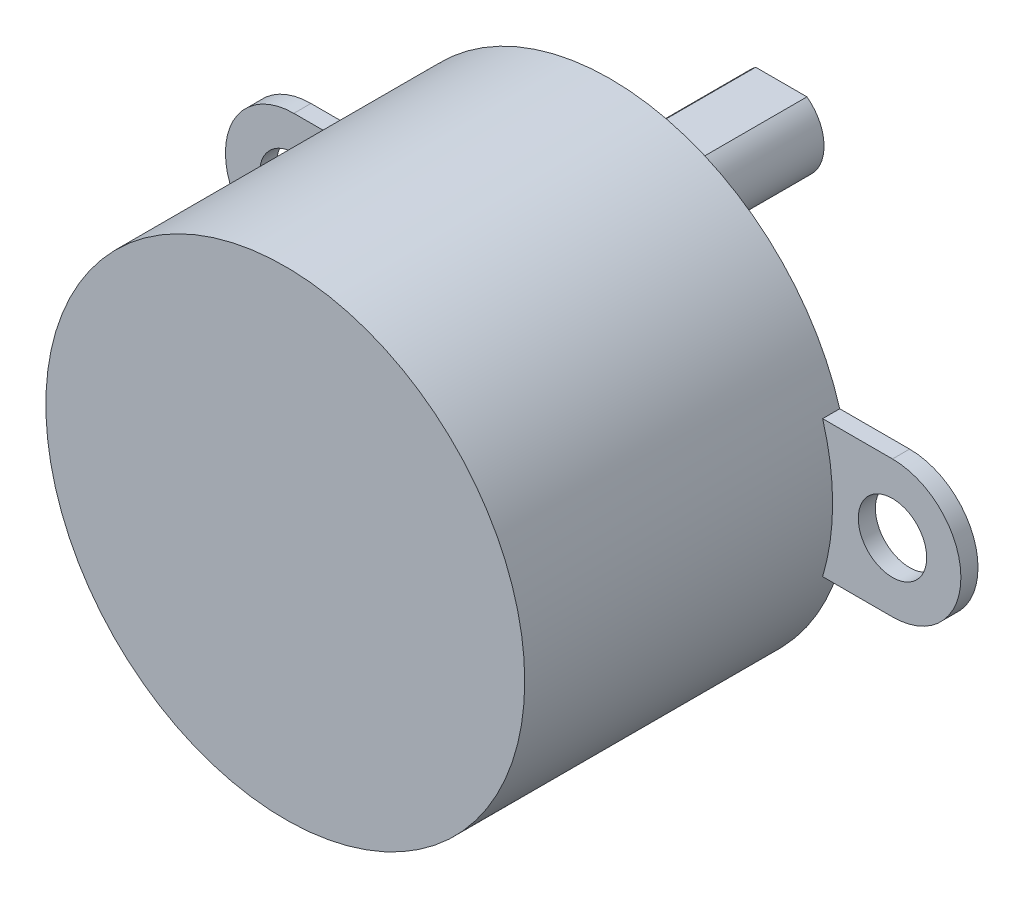
ISO-10303-21;
HEADER;
FILE_DESCRIPTION(('STEP AP214'),'2;1');
FILE_NAME('part.step','',(''),(''),'','','');
FILE_SCHEMA(('AUTOMOTIVE_DESIGN { 1 0 10303 214 1 1 1 1 }'));
ENDSEC;
DATA;
#1=APPLICATION_CONTEXT('core data for automotive mechanical design processes');
#2=APPLICATION_PROTOCOL_DEFINITION('international standard','automotive_design',2000,#1);
#3=PRODUCT_CONTEXT('',#1,'mechanical');
#4=PRODUCT('Part','Part','',(#3));
#5=PRODUCT_RELATED_PRODUCT_CATEGORY('part','',(#4));
#6=PRODUCT_DEFINITION_FORMATION('','',#4);
#7=PRODUCT_DEFINITION_CONTEXT('part definition',#1,'design');
#8=PRODUCT_DEFINITION('design','',#6,#7);
#9=PRODUCT_DEFINITION_SHAPE('','',#8);
#10=(LENGTH_UNIT() NAMED_UNIT(*) SI_UNIT(.MILLI.,.METRE.));
#11=(NAMED_UNIT(*) PLANE_ANGLE_UNIT() SI_UNIT($,.RADIAN.));
#12=(NAMED_UNIT(*) SI_UNIT($,.STERADIAN.) SOLID_ANGLE_UNIT());
#13=UNCERTAINTY_MEASURE_WITH_UNIT(LENGTH_MEASURE(1.E-05),#10,'distance_accuracy_value','');
#14=(GEOMETRIC_REPRESENTATION_CONTEXT(3) GLOBAL_UNCERTAINTY_ASSIGNED_CONTEXT((#13)) GLOBAL_UNIT_ASSIGNED_CONTEXT((#10,
#11,#12)) REPRESENTATION_CONTEXT('',''));
#15=CARTESIAN_POINT('',(0.,0.,0.));
#16=DIRECTION('',(0.,0.,1.));
#17=DIRECTION('',(1.,0.,0.));
#18=AXIS2_PLACEMENT_3D('',#15,#16,#17);
#19=CARTESIAN_POINT('',(0.,6.83524579595485,-10.));
#20=DIRECTION('',(0.,0.,1.));
#21=DIRECTION('',(1.,0.,0.));
#22=AXIS2_PLACEMENT_3D('',#19,#20,#21);
#23=CYLINDRICAL_SURFACE('',#22,2.5);
#24=CARTESIAN_POINT('',(0.,6.83524579595485,-10.));
#25=DIRECTION('',(0.,0.,-1.));
#26=DIRECTION('',(-1.,0.,0.));
#27=AXIS2_PLACEMENT_3D('',#24,#25,#26);
#28=CIRCLE('',#27,2.5);
#29=CARTESIAN_POINT('',(-1.5,4.83524579595485,-10.));
#30=VERTEX_POINT('',#29);
#31=CARTESIAN_POINT('',(-1.5,8.83524579595485,-10.));
#32=VERTEX_POINT('',#31);
#33=EDGE_CURVE('E158',#30,#32,#28,.T.);
#34=ORIENTED_EDGE('',*,*,#33,.F.);
#35=DIRECTION('',(0.,0.,-1.));
#36=VECTOR('',#35,1.);
#37=CARTESIAN_POINT('',(-1.5,4.83524579595485,1.24138126514911));
#38=LINE('',#37,#36);
#39=CARTESIAN_POINT('',(-1.5,4.83524579595485,-1.8));
#40=VERTEX_POINT('',#39);
#41=EDGE_CURVE('E55',#40,#30,#38,.T.);
#42=ORIENTED_EDGE('',*,*,#41,.F.);
#43=CARTESIAN_POINT('',(0.,6.83524579595485,-1.8));
#44=DIRECTION('',(0.,0.,-1.));
#45=DIRECTION('',(-1.,0.,0.));
#46=AXIS2_PLACEMENT_3D('',#43,#44,#45);
#47=CIRCLE('',#46,2.5);
#48=CARTESIAN_POINT('',(-1.5,8.83524579595485,-1.8));
#49=VERTEX_POINT('',#48);
#50=EDGE_CURVE('E146',#40,#49,#47,.T.);
#51=ORIENTED_EDGE('',*,*,#50,.T.);
#52=DIRECTION('',(0.,0.,-1.));
#53=VECTOR('',#52,1.);
#54=CARTESIAN_POINT('',(-1.5,8.83524579595485,1.24138126514911));
#55=LINE('',#54,#53);
#56=EDGE_CURVE('E253',#49,#32,#55,.T.);
#57=ORIENTED_EDGE('',*,*,#56,.T.);
#58=EDGE_LOOP('',(#34,#42,#51,#57));
#59=FACE_BOUND('',#58,.T.);
#60=ADVANCED_FACE('F39',(#59),#23,.T.);
#61=CARTESIAN_POINT('',(0.,0.,19.));
#62=DIRECTION('',(0.,0.,-1.));
#63=DIRECTION('',(-1.,0.,0.));
#64=AXIS2_PLACEMENT_3D('',#61,#62,#63);
#65=CYLINDRICAL_SURFACE('',#64,14.);
#66=CARTESIAN_POINT('',(0.,0.,1.));
#67=DIRECTION('',(0.,0.,-1.));
#68=DIRECTION('',(-1.,0.,0.));
#69=AXIS2_PLACEMENT_3D('',#66,#67,#68);
#70=CIRCLE('',#69,14.);
#71=CARTESIAN_POINT('',(13.4164078649987,4.00000000000001,1.));
#72=VERTEX_POINT('',#71);
#73=CARTESIAN_POINT('',(13.4164078649987,-4.00000000000001,1.));
#74=VERTEX_POINT('',#73);
#75=EDGE_CURVE('E11',#72,#74,#70,.T.);
#76=ORIENTED_EDGE('',*,*,#75,.F.);
#77=DIRECTION('',(0.,0.,-1.));
#78=VECTOR('',#77,1.);
#79=CARTESIAN_POINT('',(13.4164078649987,4.00000000000001,19.));
#80=LINE('',#79,#78);
#81=CARTESIAN_POINT('',(13.4164078649987,4.00000000000001,0.));
#82=VERTEX_POINT('',#81);
#83=EDGE_CURVE('E237',#72,#82,#80,.T.);
#84=ORIENTED_EDGE('',*,*,#83,.T.);
#85=CARTESIAN_POINT('',(0.,0.,0.));
#86=DIRECTION('',(0.,0.,1.));
#87=DIRECTION('',(1.,0.,0.));
#88=AXIS2_PLACEMENT_3D('',#85,#86,#87);
#89=CIRCLE('',#88,14.);
#90=CARTESIAN_POINT('',(-13.4164078649987,4.00000000000001,0.));
#91=VERTEX_POINT('',#90);
#92=EDGE_CURVE('E172',#82,#91,#89,.T.);
#93=ORIENTED_EDGE('',*,*,#92,.T.);
#94=DIRECTION('',(0.,0.,-1.));
#95=VECTOR('',#94,1.);
#96=CARTESIAN_POINT('',(-13.4164078649987,4.00000000000001,19.));
#97=LINE('',#96,#95);
#98=CARTESIAN_POINT('',(-13.4164078649987,4.00000000000001,1.));
#99=VERTEX_POINT('',#98);
#100=EDGE_CURVE('E235',#91,#99,#97,.F.);
#101=ORIENTED_EDGE('',*,*,#100,.T.);
#102=CARTESIAN_POINT('',(-13.4164078649987,-4.,1.));
#103=VERTEX_POINT('',#102);
#104=EDGE_CURVE('E43',#103,#99,#70,.T.);
#105=ORIENTED_EDGE('',*,*,#104,.F.);
#106=DIRECTION('',(0.,0.,-1.));
#107=VECTOR('',#106,1.);
#108=CARTESIAN_POINT('',(-13.4164078649987,-4.,19.));
#109=LINE('',#108,#107);
#110=CARTESIAN_POINT('',(-13.4164078649987,-4.,0.));
#111=VERTEX_POINT('',#110);
#112=EDGE_CURVE('E183',#103,#111,#109,.T.);
#113=ORIENTED_EDGE('',*,*,#112,.T.);
#114=CARTESIAN_POINT('',(13.4164078649987,-4.00000000000001,0.));
#115=VERTEX_POINT('',#114);
#116=EDGE_CURVE('E164',#111,#115,#89,.T.);
#117=ORIENTED_EDGE('',*,*,#116,.T.);
#118=DIRECTION('',(0.,0.,-1.));
#119=VECTOR('',#118,1.);
#120=CARTESIAN_POINT('',(13.4164078649987,-4.00000000000001,19.));
#121=LINE('',#120,#119);
#122=EDGE_CURVE('E181',#115,#74,#121,.F.);
#123=ORIENTED_EDGE('',*,*,#122,.T.);
#124=EDGE_LOOP('',(#76,#84,#93,#101,#105,#113,#117,#123));
#125=FACE_BOUND('',#124,.T.);
#126=CARTESIAN_POINT('',(0.,0.,19.));
#127=DIRECTION('',(0.,0.,1.));
#128=DIRECTION('',(1.,0.,0.));
#129=AXIS2_PLACEMENT_3D('',#126,#127,#128);
#130=CIRCLE('',#129,14.);
#131=CARTESIAN_POINT('',(14.,0.,19.));
#132=VERTEX_POINT('',#131);
#133=EDGE_CURVE('E155',#132,#132,#130,.T.);
#134=ORIENTED_EDGE('',*,*,#133,.F.);
#135=EDGE_LOOP('',(#134));
#136=FACE_BOUND('',#135,.T.);
#137=ADVANCED_FACE('F41',(#125,#136),#65,.T.);
#138=CARTESIAN_POINT('',(0.,0.,19.));
#139=DIRECTION('',(0.,0.,1.));
#140=DIRECTION('',(1.,0.,0.));
#141=AXIS2_PLACEMENT_3D('',#138,#139,#140);
#142=PLANE('',#141);
#143=ORIENTED_EDGE('',*,*,#133,.T.);
#144=EDGE_LOOP('',(#143));
#145=FACE_BOUND('',#144,.T.);
#146=ADVANCED_FACE('F322',(#145),#142,.T.);
#147=CARTESIAN_POINT('',(0.,0.,0.));
#148=DIRECTION('',(0.,0.,1.));
#149=DIRECTION('',(1.,0.,0.));
#150=AXIS2_PLACEMENT_3D('',#147,#148,#149);
#151=PLANE('',#150);
#152=CARTESIAN_POINT('',(0.,6.83524579595485,0.));
#153=DIRECTION('',(0.,0.,1.));
#154=DIRECTION('',(1.,0.,0.));
#155=AXIS2_PLACEMENT_3D('',#152,#153,#154);
#156=CIRCLE('',#155,4.);
#157=CARTESIAN_POINT('',(4.,6.83524579595485,0.));
#158=VERTEX_POINT('',#157);
#159=EDGE_CURVE('E165',#158,#158,#156,.T.);
#160=ORIENTED_EDGE('',*,*,#159,.T.);
#161=EDGE_LOOP('',(#160));
#162=FACE_BOUND('',#161,.T.);
#163=ORIENTED_EDGE('',*,*,#116,.F.);
#164=DIRECTION('',(-1.,0.,0.));
#165=VECTOR('',#164,1.);
#166=CARTESIAN_POINT('',(17.5,-4.00000000000001,0.));
#167=LINE('',#166,#165);
#168=CARTESIAN_POINT('',(-17.5,-4.,0.));
#169=VERTEX_POINT('',#168);
#170=EDGE_CURVE('E204',#111,#169,#167,.T.);
#171=ORIENTED_EDGE('',*,*,#170,.T.);
#172=CARTESIAN_POINT('',(-17.5,0.,0.));
#173=DIRECTION('',(0.,0.,-1.));
#174=DIRECTION('',(-1.,0.,0.));
#175=AXIS2_PLACEMENT_3D('',#172,#173,#174);
#176=CIRCLE('',#175,4.00000000000001);
#177=CARTESIAN_POINT('',(-17.5,4.00000000000001,0.));
#178=VERTEX_POINT('',#177);
#179=EDGE_CURVE('E203',#169,#178,#176,.T.);
#180=ORIENTED_EDGE('',*,*,#179,.T.);
#181=DIRECTION('',(1.,0.,0.));
#182=VECTOR('',#181,1.);
#183=CARTESIAN_POINT('',(17.5,4.00000000000001,0.));
#184=LINE('',#183,#182);
#185=EDGE_CURVE('E214',#178,#91,#184,.T.);
#186=ORIENTED_EDGE('',*,*,#185,.T.);
#187=ORIENTED_EDGE('',*,*,#92,.F.);
#188=CARTESIAN_POINT('',(17.5,4.00000000000001,0.));
#189=VERTEX_POINT('',#188);
#190=EDGE_CURVE('E209',#82,#189,#184,.T.);
#191=ORIENTED_EDGE('',*,*,#190,.T.);
#192=CARTESIAN_POINT('',(17.5,0.,0.));
#193=DIRECTION('',(0.,0.,-1.));
#194=DIRECTION('',(-1.,0.,0.));
#195=AXIS2_PLACEMENT_3D('',#192,#193,#194);
#196=CIRCLE('',#195,4.00000000000001);
#197=CARTESIAN_POINT('',(17.5,-4.00000000000001,0.));
#198=VERTEX_POINT('',#197);
#199=EDGE_CURVE('E201',#189,#198,#196,.T.);
#200=ORIENTED_EDGE('',*,*,#199,.T.);
#201=EDGE_CURVE('E191',#198,#115,#167,.T.);
#202=ORIENTED_EDGE('',*,*,#201,.T.);
#203=EDGE_LOOP('',(#163,#171,#180,#186,#187,#191,#200,#202));
#204=FACE_BOUND('',#203,.T.);
#205=CARTESIAN_POINT('',(-17.5,0.,0.));
#206=DIRECTION('',(0.,0.,-1.));
#207=DIRECTION('',(-1.,0.,0.));
#208=AXIS2_PLACEMENT_3D('',#205,#206,#207);
#209=CIRCLE('',#208,2.);
#210=CARTESIAN_POINT('',(-19.5,0.,0.));
#211=VERTEX_POINT('',#210);
#212=EDGE_CURVE('E265',#211,#211,#209,.T.);
#213=ORIENTED_EDGE('',*,*,#212,.F.);
#214=EDGE_LOOP('',(#213));
#215=FACE_BOUND('',#214,.T.);
#216=CARTESIAN_POINT('',(17.5,0.,0.));
#217=DIRECTION('',(0.,0.,-1.));
#218=DIRECTION('',(-1.,0.,0.));
#219=AXIS2_PLACEMENT_3D('',#216,#217,#218);
#220=CIRCLE('',#219,2.);
#221=CARTESIAN_POINT('',(15.5,0.,0.));
#222=VERTEX_POINT('',#221);
#223=EDGE_CURVE('E266',#222,#222,#220,.T.);
#224=ORIENTED_EDGE('',*,*,#223,.F.);
#225=EDGE_LOOP('',(#224));
#226=FACE_BOUND('',#225,.T.);
#227=ADVANCED_FACE('F198',(#162,#204,#215,#226),#151,.F.);
#228=CARTESIAN_POINT('',(0.,6.83524579595485,-1.8));
#229=DIRECTION('',(0.,0.,1.));
#230=DIRECTION('',(1.,0.,0.));
#231=AXIS2_PLACEMENT_3D('',#228,#229,#230);
#232=CYLINDRICAL_SURFACE('',#231,4.);
#233=CARTESIAN_POINT('',(0.,6.83524579595485,-1.8));
#234=DIRECTION('',(0.,0.,1.));
#235=DIRECTION('',(1.,0.,0.));
#236=AXIS2_PLACEMENT_3D('',#233,#234,#235);
#237=CIRCLE('',#236,4.);
#238=CARTESIAN_POINT('',(4.,6.83524579595485,-1.8));
#239=VERTEX_POINT('',#238);
#240=EDGE_CURVE('E160',#239,#239,#237,.T.);
#241=ORIENTED_EDGE('',*,*,#240,.T.);
#242=EDGE_LOOP('',(#241));
#243=FACE_BOUND('',#242,.T.);
#244=ORIENTED_EDGE('',*,*,#159,.F.);
#245=EDGE_LOOP('',(#244));
#246=FACE_BOUND('',#245,.T.);
#247=ADVANCED_FACE('F331',(#243,#246),#232,.T.);
#248=CARTESIAN_POINT('',(0.,6.83524579595485,-1.8));
#249=DIRECTION('',(0.,0.,1.));
#250=DIRECTION('',(1.,0.,0.));
#251=AXIS2_PLACEMENT_3D('',#248,#249,#250);
#252=PLANE('',#251);
#253=CARTESIAN_POINT('',(1.5,8.83524579595485,-1.8));
#254=VERTEX_POINT('',#253);
#255=CARTESIAN_POINT('',(1.5,4.83524579595485,-1.8));
#256=VERTEX_POINT('',#255);
#257=EDGE_CURVE('E144',#254,#256,#47,.T.);
#258=ORIENTED_EDGE('',*,*,#257,.F.);
#259=DIRECTION('',(-1.,0.,0.));
#260=VECTOR('',#259,1.);
#261=CARTESIAN_POINT('',(1.5,8.83524579595485,-1.8));
#262=LINE('',#261,#260);
#263=EDGE_CURVE('E250',#254,#49,#262,.T.);
#264=ORIENTED_EDGE('',*,*,#263,.T.);
#265=ORIENTED_EDGE('',*,*,#50,.F.);
#266=DIRECTION('',(1.,0.,0.));
#267=VECTOR('',#266,1.);
#268=CARTESIAN_POINT('',(-1.5,4.83524579595485,-1.8));
#269=LINE('',#268,#267);
#270=EDGE_CURVE('E130',#40,#256,#269,.T.);
#271=ORIENTED_EDGE('',*,*,#270,.T.);
#272=EDGE_LOOP('',(#258,#264,#265,#271));
#273=FACE_BOUND('',#272,.T.);
#274=ORIENTED_EDGE('',*,*,#240,.F.);
#275=EDGE_LOOP('',(#274));
#276=FACE_BOUND('',#275,.T.);
#277=ADVANCED_FACE('F141',(#273,#276),#252,.F.);
#278=ORIENTED_EDGE('',*,*,#257,.T.);
#279=DIRECTION('',(0.,0.,-1.));
#280=VECTOR('',#279,1.);
#281=CARTESIAN_POINT('',(1.5,4.83524579595485,1.24138126514911));
#282=LINE('',#281,#280);
#283=CARTESIAN_POINT('',(1.5,4.83524579595485,-10.));
#284=VERTEX_POINT('',#283);
#285=EDGE_CURVE('E127',#256,#284,#282,.T.);
#286=ORIENTED_EDGE('',*,*,#285,.T.);
#287=CARTESIAN_POINT('',(1.5,8.83524579595485,-10.));
#288=VERTEX_POINT('',#287);
#289=EDGE_CURVE('E169',#288,#284,#28,.T.);
#290=ORIENTED_EDGE('',*,*,#289,.F.);
#291=DIRECTION('',(0.,0.,-1.));
#292=VECTOR('',#291,1.);
#293=CARTESIAN_POINT('',(1.5,8.83524579595485,1.24138126514911));
#294=LINE('',#293,#292);
#295=EDGE_CURVE('E63',#254,#288,#294,.T.);
#296=ORIENTED_EDGE('',*,*,#295,.F.);
#297=EDGE_LOOP('',(#278,#286,#290,#296));
#298=FACE_BOUND('',#297,.T.);
#299=ADVANCED_FACE('F149',(#298),#23,.T.);
#300=CARTESIAN_POINT('',(0.,6.83524579595485,-10.));
#301=DIRECTION('',(0.,0.,-1.));
#302=DIRECTION('',(-1.,0.,0.));
#303=AXIS2_PLACEMENT_3D('',#300,#301,#302);
#304=PLANE('',#303);
#305=DIRECTION('',(1.,0.,0.));
#306=VECTOR('',#305,1.);
#307=CARTESIAN_POINT('',(-1.5,4.83524579595485,-10.));
#308=LINE('',#307,#306);
#309=EDGE_CURVE('E131',#30,#284,#308,.T.);
#310=ORIENTED_EDGE('',*,*,#309,.F.);
#311=ORIENTED_EDGE('',*,*,#33,.T.);
#312=DIRECTION('',(-1.,0.,0.));
#313=VECTOR('',#312,1.);
#314=CARTESIAN_POINT('',(1.5,8.83524579595485,-10.));
#315=LINE('',#314,#313);
#316=EDGE_CURVE('E247',#288,#32,#315,.T.);
#317=ORIENTED_EDGE('',*,*,#316,.F.);
#318=ORIENTED_EDGE('',*,*,#289,.T.);
#319=EDGE_LOOP('',(#310,#311,#317,#318));
#320=FACE_BOUND('',#319,.T.);
#321=ADVANCED_FACE('F246',(#320),#304,.T.);
#322=CARTESIAN_POINT('',(-17.5,0.,1.));
#323=DIRECTION('',(0.,0.,-1.));
#324=DIRECTION('',(-1.,0.,0.));
#325=AXIS2_PLACEMENT_3D('',#322,#323,#324);
#326=CYLINDRICAL_SURFACE('',#325,4.00000000000001);
#327=ORIENTED_EDGE('',*,*,#179,.F.);
#328=DIRECTION('',(0.,0.,-1.));
#329=VECTOR('',#328,1.);
#330=CARTESIAN_POINT('',(-17.5,-4.,1.));
#331=LINE('',#330,#329);
#332=CARTESIAN_POINT('',(-17.5,-4.,1.));
#333=VERTEX_POINT('',#332);
#334=EDGE_CURVE('E225',#333,#169,#331,.T.);
#335=ORIENTED_EDGE('',*,*,#334,.F.);
#336=CARTESIAN_POINT('',(-17.5,0.,1.));
#337=DIRECTION('',(0.,0.,-1.));
#338=DIRECTION('',(-1.,0.,0.));
#339=AXIS2_PLACEMENT_3D('',#336,#337,#338);
#340=CIRCLE('',#339,4.00000000000001);
#341=CARTESIAN_POINT('',(-17.5,4.00000000000001,1.));
#342=VERTEX_POINT('',#341);
#343=EDGE_CURVE('E283',#333,#342,#340,.T.);
#344=ORIENTED_EDGE('',*,*,#343,.T.);
#345=DIRECTION('',(0.,0.,-1.));
#346=VECTOR('',#345,1.);
#347=CARTESIAN_POINT('',(-17.5,4.00000000000001,1.));
#348=LINE('',#347,#346);
#349=EDGE_CURVE('E222',#342,#178,#348,.T.);
#350=ORIENTED_EDGE('',*,*,#349,.T.);
#351=EDGE_LOOP('',(#327,#335,#344,#350));
#352=FACE_BOUND('',#351,.T.);
#353=ADVANCED_FACE('F330',(#352),#326,.T.);
#354=CARTESIAN_POINT('',(-17.5,0.,1.));
#355=DIRECTION('',(0.,0.,-1.));
#356=DIRECTION('',(-1.,0.,0.));
#357=AXIS2_PLACEMENT_3D('',#354,#355,#356);
#358=CYLINDRICAL_SURFACE('',#357,2.);
#359=CARTESIAN_POINT('',(-17.5,0.,1.));
#360=DIRECTION('',(0.,0.,-1.));
#361=DIRECTION('',(-1.,0.,0.));
#362=AXIS2_PLACEMENT_3D('',#359,#360,#361);
#363=CIRCLE('',#362,2.);
#364=CARTESIAN_POINT('',(-19.5,0.,1.));
#365=VERTEX_POINT('',#364);
#366=EDGE_CURVE('E270',#365,#365,#363,.T.);
#367=ORIENTED_EDGE('',*,*,#366,.F.);
#368=EDGE_LOOP('',(#367));
#369=FACE_BOUND('',#368,.T.);
#370=ORIENTED_EDGE('',*,*,#212,.T.);
#371=EDGE_LOOP('',(#370));
#372=FACE_BOUND('',#371,.T.);
#373=ADVANCED_FACE('F314',(#369,#372),#358,.F.);
#374=CARTESIAN_POINT('',(17.5,0.,1.));
#375=DIRECTION('',(0.,0.,-1.));
#376=DIRECTION('',(-1.,0.,0.));
#377=AXIS2_PLACEMENT_3D('',#374,#375,#376);
#378=PLANE('',#377);
#379=ORIENTED_EDGE('',*,*,#366,.T.);
#380=EDGE_LOOP('',(#379));
#381=FACE_BOUND('',#380,.T.);
#382=DIRECTION('',(-1.,0.,0.));
#383=VECTOR('',#382,1.);
#384=CARTESIAN_POINT('',(17.5,-4.00000000000001,1.));
#385=LINE('',#384,#383);
#386=EDGE_CURVE('E280',#103,#333,#385,.T.);
#387=ORIENTED_EDGE('',*,*,#386,.F.);
#388=ORIENTED_EDGE('',*,*,#104,.T.);
#389=DIRECTION('',(1.,0.,0.));
#390=VECTOR('',#389,1.);
#391=CARTESIAN_POINT('',(17.5,4.00000000000001,1.));
#392=LINE('',#391,#390);
#393=EDGE_CURVE('E231',#342,#99,#392,.T.);
#394=ORIENTED_EDGE('',*,*,#393,.F.);
#395=ORIENTED_EDGE('',*,*,#343,.F.);
#396=EDGE_LOOP('',(#387,#388,#394,#395));
#397=FACE_BOUND('',#396,.T.);
#398=ADVANCED_FACE('F305',(#381,#397),#378,.F.);
#399=CARTESIAN_POINT('',(17.5,-4.00000000000001,1.));
#400=DIRECTION('',(0.,-1.,0.));
#401=DIRECTION('',(1.,0.,0.));
#402=AXIS2_PLACEMENT_3D('',#399,#400,#401);
#403=PLANE('',#402);
#404=ORIENTED_EDGE('',*,*,#112,.F.);
#405=ORIENTED_EDGE('',*,*,#386,.T.);
#406=ORIENTED_EDGE('',*,*,#334,.T.);
#407=ORIENTED_EDGE('',*,*,#170,.F.);
#408=EDGE_LOOP('',(#404,#405,#406,#407));
#409=FACE_BOUND('',#408,.T.);
#410=ADVANCED_FACE('F311',(#409),#403,.T.);
#411=CARTESIAN_POINT('',(17.5,4.00000000000001,1.));
#412=DIRECTION('',(0.,1.,0.));
#413=DIRECTION('',(-1.,0.,0.));
#414=AXIS2_PLACEMENT_3D('',#411,#412,#413);
#415=PLANE('',#414);
#416=ORIENTED_EDGE('',*,*,#100,.F.);
#417=ORIENTED_EDGE('',*,*,#185,.F.);
#418=ORIENTED_EDGE('',*,*,#349,.F.);
#419=ORIENTED_EDGE('',*,*,#393,.T.);
#420=EDGE_LOOP('',(#416,#417,#418,#419));
#421=FACE_BOUND('',#420,.T.);
#422=ADVANCED_FACE('F302',(#421),#415,.T.);
#423=CARTESIAN_POINT('',(17.5,0.,1.));
#424=DIRECTION('',(0.,0.,-1.));
#425=DIRECTION('',(-1.,0.,0.));
#426=AXIS2_PLACEMENT_3D('',#423,#424,#425);
#427=CIRCLE('',#426,2.);
#428=CARTESIAN_POINT('',(15.5,0.,1.));
#429=VERTEX_POINT('',#428);
#430=EDGE_CURVE('E261',#429,#429,#427,.T.);
#431=ORIENTED_EDGE('',*,*,#430,.T.);
#432=EDGE_LOOP('',(#431));
#433=FACE_BOUND('',#432,.T.);
#434=CARTESIAN_POINT('',(17.5,4.00000000000001,1.));
#435=VERTEX_POINT('',#434);
#436=EDGE_CURVE('E286',#72,#435,#392,.T.);
#437=ORIENTED_EDGE('',*,*,#436,.F.);
#438=ORIENTED_EDGE('',*,*,#75,.T.);
#439=CARTESIAN_POINT('',(17.5,-4.00000000000001,1.));
#440=VERTEX_POINT('',#439);
#441=EDGE_CURVE('E194',#440,#74,#385,.T.);
#442=ORIENTED_EDGE('',*,*,#441,.F.);
#443=CARTESIAN_POINT('',(17.5,0.,1.));
#444=DIRECTION('',(0.,0.,-1.));
#445=DIRECTION('',(-1.,0.,0.));
#446=AXIS2_PLACEMENT_3D('',#443,#444,#445);
#447=CIRCLE('',#446,4.00000000000001);
#448=EDGE_CURVE('E218',#435,#440,#447,.T.);
#449=ORIENTED_EDGE('',*,*,#448,.F.);
#450=EDGE_LOOP('',(#437,#438,#442,#449));
#451=FACE_BOUND('',#450,.T.);
#452=ADVANCED_FACE('F300',(#433,#451),#378,.F.);
#453=ORIENTED_EDGE('',*,*,#83,.F.);
#454=ORIENTED_EDGE('',*,*,#436,.T.);
#455=DIRECTION('',(0.,0.,-1.));
#456=VECTOR('',#455,1.);
#457=CARTESIAN_POINT('',(17.5,4.00000000000001,1.));
#458=LINE('',#457,#456);
#459=EDGE_CURVE('E196',#435,#189,#458,.T.);
#460=ORIENTED_EDGE('',*,*,#459,.T.);
#461=ORIENTED_EDGE('',*,*,#190,.F.);
#462=EDGE_LOOP('',(#453,#454,#460,#461));
#463=FACE_BOUND('',#462,.T.);
#464=ADVANCED_FACE('F295',(#463),#415,.T.);
#465=ORIENTED_EDGE('',*,*,#122,.F.);
#466=ORIENTED_EDGE('',*,*,#201,.F.);
#467=DIRECTION('',(0.,0.,-1.));
#468=VECTOR('',#467,1.);
#469=CARTESIAN_POINT('',(17.5,-4.00000000000001,1.));
#470=LINE('',#469,#468);
#471=EDGE_CURVE('E229',#440,#198,#470,.T.);
#472=ORIENTED_EDGE('',*,*,#471,.F.);
#473=ORIENTED_EDGE('',*,*,#441,.T.);
#474=EDGE_LOOP('',(#465,#466,#472,#473));
#475=FACE_BOUND('',#474,.T.);
#476=ADVANCED_FACE('F190',(#475),#403,.T.);
#477=CARTESIAN_POINT('',(17.5,0.,1.));
#478=DIRECTION('',(0.,0.,-1.));
#479=DIRECTION('',(-1.,0.,0.));
#480=AXIS2_PLACEMENT_3D('',#477,#478,#479);
#481=CYLINDRICAL_SURFACE('',#480,4.00000000000001);
#482=ORIENTED_EDGE('',*,*,#199,.F.);
#483=ORIENTED_EDGE('',*,*,#459,.F.);
#484=ORIENTED_EDGE('',*,*,#448,.T.);
#485=ORIENTED_EDGE('',*,*,#471,.T.);
#486=EDGE_LOOP('',(#482,#483,#484,#485));
#487=FACE_BOUND('',#486,.T.);
#488=ADVANCED_FACE('F299',(#487),#481,.T.);
#489=CARTESIAN_POINT('',(17.5,0.,1.));
#490=DIRECTION('',(0.,0.,-1.));
#491=DIRECTION('',(-1.,0.,0.));
#492=AXIS2_PLACEMENT_3D('',#489,#490,#491);
#493=CYLINDRICAL_SURFACE('',#492,2.);
#494=ORIENTED_EDGE('',*,*,#430,.F.);
#495=EDGE_LOOP('',(#494));
#496=FACE_BOUND('',#495,.T.);
#497=ORIENTED_EDGE('',*,*,#223,.T.);
#498=EDGE_LOOP('',(#497));
#499=FACE_BOUND('',#498,.T.);
#500=ADVANCED_FACE('F419',(#496,#499),#493,.F.);
#501=CARTESIAN_POINT('',(1.5,8.83524579595485,1.24138126514911));
#502=DIRECTION('',(0.,-1.,0.));
#503=DIRECTION('',(0.,0.,-1.));
#504=AXIS2_PLACEMENT_3D('',#501,#502,#503);
#505=PLANE('',#504);
#506=ORIENTED_EDGE('',*,*,#295,.T.);
#507=ORIENTED_EDGE('',*,*,#316,.T.);
#508=ORIENTED_EDGE('',*,*,#56,.F.);
#509=ORIENTED_EDGE('',*,*,#263,.F.);
#510=EDGE_LOOP('',(#506,#507,#508,#509));
#511=FACE_BOUND('',#510,.T.);
#512=ADVANCED_FACE('F427',(#511),#505,.F.);
#513=CARTESIAN_POINT('',(-1.5,4.83524579595485,1.24138126514911));
#514=DIRECTION('',(0.,1.,0.));
#515=DIRECTION('',(0.,0.,1.));
#516=AXIS2_PLACEMENT_3D('',#513,#514,#515);
#517=PLANE('',#516);
#518=ORIENTED_EDGE('',*,*,#41,.T.);
#519=ORIENTED_EDGE('',*,*,#309,.T.);
#520=ORIENTED_EDGE('',*,*,#285,.F.);
#521=ORIENTED_EDGE('',*,*,#270,.F.);
#522=EDGE_LOOP('',(#518,#519,#520,#521));
#523=FACE_BOUND('',#522,.T.);
#524=ADVANCED_FACE('F129',(#523),#517,.F.);
#525=CLOSED_SHELL('',(#60,#137,#146,#227,#247,#277,#299,#321,#353,#373,#398,#410,#422,#452,#464,
#476,#488,#500,#512,#524));
#526=MANIFOLD_SOLID_BREP('B2',#525);
#527=ADVANCED_BREP_SHAPE_REPRESENTATION('',(#18,#526),#14);
#528=SHAPE_DEFINITION_REPRESENTATION(#9,#527);
ENDSEC;
END-ISO-10303-21;
